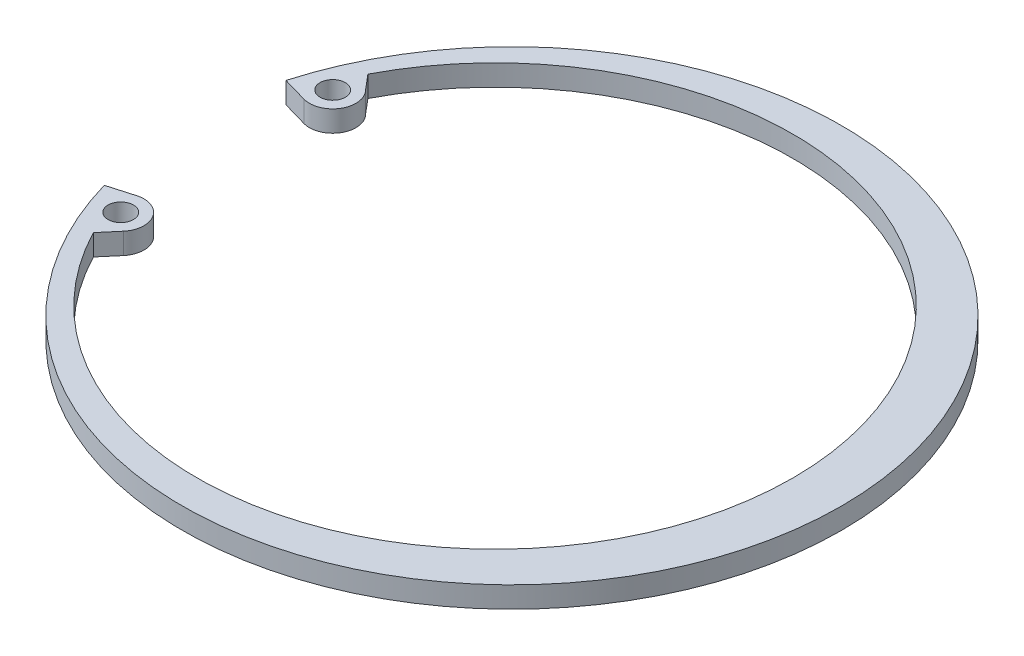
ISO-10303-21;
HEADER;
FILE_DESCRIPTION(('STEP AP214'),'2;1');
FILE_NAME('part.step','',(''),(''),'','','');
FILE_SCHEMA(('AUTOMOTIVE_DESIGN { 1 0 10303 214 1 1 1 1 }'));
ENDSEC;
DATA;
#1=APPLICATION_CONTEXT('core data for automotive mechanical design processes');
#2=APPLICATION_PROTOCOL_DEFINITION('international standard','automotive_design',2000,#1);
#3=PRODUCT_CONTEXT('',#1,'mechanical');
#4=PRODUCT('Part','Part','',(#3));
#5=PRODUCT_RELATED_PRODUCT_CATEGORY('part','',(#4));
#6=PRODUCT_DEFINITION_FORMATION('','',#4);
#7=PRODUCT_DEFINITION_CONTEXT('part definition',#1,'design');
#8=PRODUCT_DEFINITION('design','',#6,#7);
#9=PRODUCT_DEFINITION_SHAPE('','',#8);
#10=(LENGTH_UNIT() NAMED_UNIT(*) SI_UNIT(.MILLI.,.METRE.));
#11=(NAMED_UNIT(*) PLANE_ANGLE_UNIT() SI_UNIT($,.RADIAN.));
#12=(NAMED_UNIT(*) SI_UNIT($,.STERADIAN.) SOLID_ANGLE_UNIT());
#13=UNCERTAINTY_MEASURE_WITH_UNIT(LENGTH_MEASURE(1.E-05),#10,'distance_accuracy_value','');
#14=(GEOMETRIC_REPRESENTATION_CONTEXT(3) GLOBAL_UNCERTAINTY_ASSIGNED_CONTEXT((#13)) GLOBAL_UNIT_ASSIGNED_CONTEXT((#10,
#11,#12)) REPRESENTATION_CONTEXT('',''));
#15=CARTESIAN_POINT('',(0.,0.,0.));
#16=DIRECTION('',(0.,0.,1.));
#17=DIRECTION('',(1.,0.,0.));
#18=AXIS2_PLACEMENT_3D('',#15,#16,#17);
#19=CARTESIAN_POINT('',(0.,-2.5,0.));
#20=DIRECTION('',(0.,1.,0.));
#21=DIRECTION('',(0.,0.,1.));
#22=AXIS2_PLACEMENT_3D('',#19,#20,#21);
#23=CYLINDRICAL_SURFACE('',#22,39.);
#24=CARTESIAN_POINT('',(0.,0.,0.));
#25=DIRECTION('',(0.,1.,0.));
#26=DIRECTION('',(0.,0.,-1.));
#27=AXIS2_PLACEMENT_3D('',#24,#25,#26);
#28=CIRCLE('',#27,39.);
#29=CARTESIAN_POINT('',(-37.4892061415945,0.,10.7498568768627));
#30=VERTEX_POINT('',#29);
#31=CARTESIAN_POINT('',(-37.4892061415945,0.,-10.7498568768627));
#32=VERTEX_POINT('',#31);
#33=EDGE_CURVE('E141',#30,#32,#28,.T.);
#34=ORIENTED_EDGE('',*,*,#33,.F.);
#35=DIRECTION('',(0.,1.,0.));
#36=VECTOR('',#35,1.);
#37=CARTESIAN_POINT('',(-37.4892061415945,-2.5,10.7498568768627));
#38=LINE('',#37,#36);
#39=CARTESIAN_POINT('',(-37.4892061415945,-2.5,10.7498568768627));
#40=VERTEX_POINT('',#39);
#41=EDGE_CURVE('E11',#40,#30,#38,.T.);
#42=ORIENTED_EDGE('',*,*,#41,.F.);
#43=CARTESIAN_POINT('',(0.,-2.5,0.));
#44=DIRECTION('',(0.,1.,0.));
#45=DIRECTION('',(0.,0.,-1.));
#46=AXIS2_PLACEMENT_3D('',#43,#44,#45);
#47=CIRCLE('',#46,39.);
#48=CARTESIAN_POINT('',(-37.4892061415945,-2.5,-10.7498568768627));
#49=VERTEX_POINT('',#48);
#50=EDGE_CURVE('E162',#40,#49,#47,.T.);
#51=ORIENTED_EDGE('',*,*,#50,.T.);
#52=DIRECTION('',(0.,1.,0.));
#53=VECTOR('',#52,1.);
#54=CARTESIAN_POINT('',(-37.4892061415945,-2.5,-10.7498568768627));
#55=LINE('',#54,#53);
#56=EDGE_CURVE('E47',#49,#32,#55,.T.);
#57=ORIENTED_EDGE('',*,*,#56,.T.);
#58=EDGE_LOOP('',(#34,#42,#51,#57));
#59=FACE_BOUND('',#58,.T.);
#60=ADVANCED_FACE('F44',(#59),#23,.T.);
#61=CARTESIAN_POINT('',(-37.4892061415945,-2.5,10.7498568768627));
#62=DIRECTION('',(-0.275637355816993,0.,-0.961261695938321));
#63=DIRECTION('',(-0.961261695938321,0.,0.275637355816993));
#64=AXIS2_PLACEMENT_3D('',#61,#62,#63);
#65=PLANE('',#64);
#66=DIRECTION('',(-0.961261695938321,0.,0.275637355816993));
#67=VECTOR('',#66,1.);
#68=CARTESIAN_POINT('',(-37.4892061415945,0.,10.7498568768627));
#69=LINE('',#68,#67);
#70=CARTESIAN_POINT('',(-34.5080027284967,0.,9.89501055414854));
#71=VERTEX_POINT('',#70);
#72=EDGE_CURVE('E160',#71,#30,#69,.T.);
#73=ORIENTED_EDGE('',*,*,#72,.F.);
#74=DIRECTION('',(0.,1.,0.));
#75=VECTOR('',#74,1.);
#76=CARTESIAN_POINT('',(-34.5080027284967,-2.5,9.89501055414854));
#77=LINE('',#76,#75);
#78=CARTESIAN_POINT('',(-34.5080027284967,-2.5,9.89501055414854));
#79=VERTEX_POINT('',#78);
#80=EDGE_CURVE('E53',#79,#71,#77,.T.);
#81=ORIENTED_EDGE('',*,*,#80,.F.);
#82=DIRECTION('',(-0.961261695938321,0.,0.275637355816993));
#83=VECTOR('',#82,1.);
#84=CARTESIAN_POINT('',(-37.4892061415945,-2.5,10.7498568768627));
#85=LINE('',#84,#83);
#86=EDGE_CURVE('E131',#79,#40,#85,.T.);
#87=ORIENTED_EDGE('',*,*,#86,.T.);
#88=ORIENTED_EDGE('',*,*,#41,.T.);
#89=EDGE_LOOP('',(#73,#81,#87,#88));
#90=FACE_BOUND('',#89,.T.);
#91=ADVANCED_FACE('F174',(#90),#65,.T.);
#92=CARTESIAN_POINT('',(-33.75,-2.5,12.5384802179789));
#93=DIRECTION('',(0.,1.,0.));
#94=DIRECTION('',(0.,0.,1.));
#95=AXIS2_PLACEMENT_3D('',#92,#93,#94);
#96=CYLINDRICAL_SURFACE('',#95,2.75);
#97=CARTESIAN_POINT('',(-33.75,0.,12.5384802179789));
#98=DIRECTION('',(0.,1.,0.));
#99=DIRECTION('',(0.,0.,-1.));
#100=AXIS2_PLACEMENT_3D('',#97,#98,#99);
#101=CIRCLE('',#100,2.75);
#102=CARTESIAN_POINT('',(-31.6534448755003,0.,14.3180747251446));
#103=VERTEX_POINT('',#102);
#104=EDGE_CURVE('E118',#103,#71,#101,.T.);
#105=ORIENTED_EDGE('',*,*,#104,.F.);
#106=DIRECTION('',(0.,1.,0.));
#107=VECTOR('',#106,1.);
#108=CARTESIAN_POINT('',(-31.6534448755003,-2.5,14.3180747251446));
#109=LINE('',#108,#107);
#110=CARTESIAN_POINT('',(-31.6534448755003,-2.5,14.3180747251446));
#111=VERTEX_POINT('',#110);
#112=EDGE_CURVE('E113',#111,#103,#109,.T.);
#113=ORIENTED_EDGE('',*,*,#112,.F.);
#114=CARTESIAN_POINT('',(-33.75,-2.5,12.5384802179789));
#115=DIRECTION('',(0.,1.,0.));
#116=DIRECTION('',(0.,0.,-1.));
#117=AXIS2_PLACEMENT_3D('',#114,#115,#116);
#118=CIRCLE('',#117,2.75);
#119=EDGE_CURVE('E116',#111,#79,#118,.T.);
#120=ORIENTED_EDGE('',*,*,#119,.T.);
#121=ORIENTED_EDGE('',*,*,#80,.T.);
#122=EDGE_LOOP('',(#105,#113,#120,#121));
#123=FACE_BOUND('',#122,.T.);
#124=ADVANCED_FACE('F115',(#123),#96,.T.);
#125=CARTESIAN_POINT('',(-33.2856586696295,-2.5,16.2409994029751));
#126=DIRECTION('',(0.762383681636247,0.,0.647125275332962));
#127=DIRECTION('',(0.647125275332962,0.,-0.762383681636247));
#128=AXIS2_PLACEMENT_3D('',#125,#126,#127);
#129=PLANE('',#128);
#130=DIRECTION('',(0.647125275332962,0.,-0.762383681636247));
#131=VECTOR('',#130,1.);
#132=CARTESIAN_POINT('',(-33.2856586696295,0.,16.2409994029751));
#133=LINE('',#132,#131);
#134=CARTESIAN_POINT('',(-33.2856586696295,0.,16.2409994029751));
#135=VERTEX_POINT('',#134);
#136=EDGE_CURVE('E157',#135,#103,#133,.T.);
#137=ORIENTED_EDGE('',*,*,#136,.F.);
#138=DIRECTION('',(0.,1.,0.));
#139=VECTOR('',#138,1.);
#140=CARTESIAN_POINT('',(-33.2856586696295,-2.5,16.2409994029751));
#141=LINE('',#140,#139);
#142=CARTESIAN_POINT('',(-33.2856586696295,-2.5,16.2409994029751));
#143=VERTEX_POINT('',#142);
#144=EDGE_CURVE('E123',#143,#135,#141,.T.);
#145=ORIENTED_EDGE('',*,*,#144,.F.);
#146=DIRECTION('',(0.647125275332962,0.,-0.762383681636247));
#147=VECTOR('',#146,1.);
#148=CARTESIAN_POINT('',(-33.2856586696295,-2.5,16.2409994029751));
#149=LINE('',#148,#147);
#150=EDGE_CURVE('E129',#143,#111,#149,.T.);
#151=ORIENTED_EDGE('',*,*,#150,.T.);
#152=ORIENTED_EDGE('',*,*,#112,.T.);
#153=EDGE_LOOP('',(#137,#145,#151,#152));
#154=FACE_BOUND('',#153,.T.);
#155=ADVANCED_FACE('F133',(#154),#129,.T.);
#156=CARTESIAN_POINT('',(-2.,-2.5,0.));
#157=DIRECTION('',(0.,1.,0.));
#158=DIRECTION('',(0.,0.,1.));
#159=AXIS2_PLACEMENT_3D('',#156,#157,#158);
#160=CYLINDRICAL_SURFACE('',#159,35.25);
#161=CARTESIAN_POINT('',(-2.,0.,0.));
#162=DIRECTION('',(0.,-1.,0.));
#163=DIRECTION('',(0.,0.,-1.));
#164=AXIS2_PLACEMENT_3D('',#161,#162,#163);
#165=CIRCLE('',#164,35.25);
#166=CARTESIAN_POINT('',(-33.2856586696295,0.,-16.2409994029751));
#167=VERTEX_POINT('',#166);
#168=EDGE_CURVE('E154',#167,#135,#165,.T.);
#169=ORIENTED_EDGE('',*,*,#168,.F.);
#170=DIRECTION('',(0.,1.,0.));
#171=VECTOR('',#170,1.);
#172=CARTESIAN_POINT('',(-33.2856586696295,-2.5,-16.2409994029751));
#173=LINE('',#172,#171);
#174=CARTESIAN_POINT('',(-33.2856586696295,-2.5,-16.2409994029751));
#175=VERTEX_POINT('',#174);
#176=EDGE_CURVE('E166',#175,#167,#173,.T.);
#177=ORIENTED_EDGE('',*,*,#176,.F.);
#178=CARTESIAN_POINT('',(-2.,-2.5,0.));
#179=DIRECTION('',(0.,-1.,0.));
#180=DIRECTION('',(0.,0.,-1.));
#181=AXIS2_PLACEMENT_3D('',#178,#179,#180);
#182=CIRCLE('',#181,35.25);
#183=EDGE_CURVE('E134',#175,#143,#182,.T.);
#184=ORIENTED_EDGE('',*,*,#183,.T.);
#185=ORIENTED_EDGE('',*,*,#144,.T.);
#186=EDGE_LOOP('',(#169,#177,#184,#185));
#187=FACE_BOUND('',#186,.T.);
#188=ADVANCED_FACE('F187',(#187),#160,.F.);
#189=CARTESIAN_POINT('',(-33.2856586696295,-2.5,-16.2409994029751));
#190=DIRECTION('',(0.764402784107994,0.,-0.64473900428619));
#191=DIRECTION('',(-0.64473900428619,0.,-0.764402784107994));
#192=AXIS2_PLACEMENT_3D('',#189,#190,#191);
#193=PLANE('',#192);
#194=DIRECTION('',(-0.64473900428619,0.,-0.764402784107994));
#195=VECTOR('',#194,1.);
#196=CARTESIAN_POINT('',(-33.2856586696295,0.,-16.2409994029751));
#197=LINE('',#196,#195);
#198=CARTESIAN_POINT('',(-31.7882066120602,0.,-14.4656197311008));
#199=VERTEX_POINT('',#198);
#200=EDGE_CURVE('E151',#199,#167,#197,.T.);
#201=ORIENTED_EDGE('',*,*,#200,.F.);
#202=DIRECTION('',(0.,1.,0.));
#203=VECTOR('',#202,1.);
#204=CARTESIAN_POINT('',(-31.7882066120602,-2.5,-14.4656197311008));
#205=LINE('',#204,#203);
#206=CARTESIAN_POINT('',(-31.7882066120602,-2.5,-14.4656197311008));
#207=VERTEX_POINT('',#206);
#208=EDGE_CURVE('E168',#207,#199,#205,.T.);
#209=ORIENTED_EDGE('',*,*,#208,.F.);
#210=DIRECTION('',(-0.64473900428619,0.,-0.764402784107994));
#211=VECTOR('',#210,1.);
#212=CARTESIAN_POINT('',(-33.2856586696295,-2.5,-16.2409994029751));
#213=LINE('',#212,#211);
#214=EDGE_CURVE('E136',#207,#175,#213,.T.);
#215=ORIENTED_EDGE('',*,*,#214,.T.);
#216=ORIENTED_EDGE('',*,*,#176,.T.);
#217=EDGE_LOOP('',(#201,#209,#215,#216));
#218=FACE_BOUND('',#217,.T.);
#219=ADVANCED_FACE('F190',(#218),#193,.T.);
#220=CARTESIAN_POINT('',(-33.75,-2.5,-12.5384802179789));
#221=DIRECTION('',(0.,1.,0.));
#222=DIRECTION('',(0.,0.,1.));
#223=AXIS2_PLACEMENT_3D('',#220,#221,#222);
#224=CYLINDRICAL_SURFACE('',#223,2.75);
#225=CARTESIAN_POINT('',(-33.75,0.,-12.5384802179789));
#226=DIRECTION('',(0.,1.,0.));
#227=DIRECTION('',(0.,0.,1.));
#228=AXIS2_PLACEMENT_3D('',#225,#226,#227);
#229=CIRCLE('',#228,2.75);
#230=CARTESIAN_POINT('',(-34.5080027284967,0.,-9.89501055414853));
#231=VERTEX_POINT('',#230);
#232=EDGE_CURVE('E148',#231,#199,#229,.T.);
#233=ORIENTED_EDGE('',*,*,#232,.F.);
#234=DIRECTION('',(0.,1.,0.));
#235=VECTOR('',#234,1.);
#236=CARTESIAN_POINT('',(-34.5080027284967,-2.5,-9.89501055414853));
#237=LINE('',#236,#235);
#238=CARTESIAN_POINT('',(-34.5080027284967,-2.5,-9.89501055414853));
#239=VERTEX_POINT('',#238);
#240=EDGE_CURVE('E169',#239,#231,#237,.T.);
#241=ORIENTED_EDGE('',*,*,#240,.F.);
#242=CARTESIAN_POINT('',(-33.75,-2.5,-12.5384802179789));
#243=DIRECTION('',(0.,1.,0.));
#244=DIRECTION('',(0.,0.,1.));
#245=AXIS2_PLACEMENT_3D('',#242,#243,#244);
#246=CIRCLE('',#245,2.75);
#247=EDGE_CURVE('E236',#239,#207,#246,.T.);
#248=ORIENTED_EDGE('',*,*,#247,.T.);
#249=ORIENTED_EDGE('',*,*,#208,.T.);
#250=EDGE_LOOP('',(#233,#241,#248,#249));
#251=FACE_BOUND('',#250,.T.);
#252=ADVANCED_FACE('F194',(#251),#224,.T.);
#253=CARTESIAN_POINT('',(-37.4892061415945,-2.5,-10.7498568768627));
#254=DIRECTION('',(-0.275637355816993,0.,0.961261695938321));
#255=DIRECTION('',(0.961261695938321,0.,0.275637355816993));
#256=AXIS2_PLACEMENT_3D('',#253,#254,#255);
#257=PLANE('',#256);
#258=DIRECTION('',(0.961261695938321,0.,0.275637355816993));
#259=VECTOR('',#258,1.);
#260=CARTESIAN_POINT('',(-37.4892061415945,0.,-10.7498568768627));
#261=LINE('',#260,#259);
#262=EDGE_CURVE('E144',#32,#231,#261,.T.);
#263=ORIENTED_EDGE('',*,*,#262,.F.);
#264=ORIENTED_EDGE('',*,*,#56,.F.);
#265=DIRECTION('',(0.961261695938321,0.,0.275637355816993));
#266=VECTOR('',#265,1.);
#267=CARTESIAN_POINT('',(-37.4892061415945,-2.5,-10.7498568768627));
#268=LINE('',#267,#266);
#269=EDGE_CURVE('E234',#49,#239,#268,.T.);
#270=ORIENTED_EDGE('',*,*,#269,.T.);
#271=ORIENTED_EDGE('',*,*,#240,.T.);
#272=EDGE_LOOP('',(#263,#264,#270,#271));
#273=FACE_BOUND('',#272,.T.);
#274=ADVANCED_FACE('F171',(#273),#257,.T.);
#275=CARTESIAN_POINT('',(0.,-2.5,0.));
#276=DIRECTION('',(0.,-1.,0.));
#277=DIRECTION('',(0.,0.,-1.));
#278=AXIS2_PLACEMENT_3D('',#275,#276,#277);
#279=PLANE('',#278);
#280=CARTESIAN_POINT('',(-33.75,-2.5,12.5384802179789));
#281=DIRECTION('',(0.,1.,0.));
#282=DIRECTION('',(0.,0.,-1.));
#283=AXIS2_PLACEMENT_3D('',#280,#281,#282);
#284=CIRCLE('',#283,1.5);
#285=CARTESIAN_POINT('',(-33.75,-2.5,11.0384802179789));
#286=VERTEX_POINT('',#285);
#287=EDGE_CURVE('E221',#286,#286,#284,.T.);
#288=ORIENTED_EDGE('',*,*,#287,.T.);
#289=EDGE_LOOP('',(#288));
#290=FACE_BOUND('',#289,.T.);
#291=CARTESIAN_POINT('',(-33.75,-2.5,-12.5384802179789));
#292=DIRECTION('',(0.,1.,0.));
#293=DIRECTION('',(0.,0.,1.));
#294=AXIS2_PLACEMENT_3D('',#291,#292,#293);
#295=CIRCLE('',#294,1.5);
#296=CARTESIAN_POINT('',(-33.75,-2.5,-11.0384802179789));
#297=VERTEX_POINT('',#296);
#298=EDGE_CURVE('E145',#297,#297,#295,.T.);
#299=ORIENTED_EDGE('',*,*,#298,.T.);
#300=EDGE_LOOP('',(#299));
#301=FACE_BOUND('',#300,.T.);
#302=ORIENTED_EDGE('',*,*,#50,.F.);
#303=ORIENTED_EDGE('',*,*,#86,.F.);
#304=ORIENTED_EDGE('',*,*,#119,.F.);
#305=ORIENTED_EDGE('',*,*,#150,.F.);
#306=ORIENTED_EDGE('',*,*,#183,.F.);
#307=ORIENTED_EDGE('',*,*,#214,.F.);
#308=ORIENTED_EDGE('',*,*,#247,.F.);
#309=ORIENTED_EDGE('',*,*,#269,.F.);
#310=EDGE_LOOP('',(#302,#303,#304,#305,#306,#307,#308,#309));
#311=FACE_BOUND('',#310,.T.);
#312=ADVANCED_FACE('F127',(#290,#301,#311),#279,.T.);
#313=CARTESIAN_POINT('',(0.,0.,0.));
#314=DIRECTION('',(0.,-1.,0.));
#315=DIRECTION('',(0.,0.,-1.));
#316=AXIS2_PLACEMENT_3D('',#313,#314,#315);
#317=PLANE('',#316);
#318=CARTESIAN_POINT('',(-33.75,0.,12.5384802179789));
#319=DIRECTION('',(0.,1.,0.));
#320=DIRECTION('',(0.,0.,-1.));
#321=AXIS2_PLACEMENT_3D('',#318,#319,#320);
#322=CIRCLE('',#321,1.5);
#323=CARTESIAN_POINT('',(-33.75,0.,11.0384802179789));
#324=VERTEX_POINT('',#323);
#325=EDGE_CURVE('E224',#324,#324,#322,.T.);
#326=ORIENTED_EDGE('',*,*,#325,.F.);
#327=EDGE_LOOP('',(#326));
#328=FACE_BOUND('',#327,.T.);
#329=CARTESIAN_POINT('',(-33.75,0.,-12.5384802179789));
#330=DIRECTION('',(0.,1.,0.));
#331=DIRECTION('',(0.,0.,1.));
#332=AXIS2_PLACEMENT_3D('',#329,#330,#331);
#333=CIRCLE('',#332,1.5);
#334=CARTESIAN_POINT('',(-33.75,0.,-11.0384802179789));
#335=VERTEX_POINT('',#334);
#336=EDGE_CURVE('E226',#335,#335,#333,.T.);
#337=ORIENTED_EDGE('',*,*,#336,.F.);
#338=EDGE_LOOP('',(#337));
#339=FACE_BOUND('',#338,.T.);
#340=ORIENTED_EDGE('',*,*,#33,.T.);
#341=ORIENTED_EDGE('',*,*,#262,.T.);
#342=ORIENTED_EDGE('',*,*,#232,.T.);
#343=ORIENTED_EDGE('',*,*,#200,.T.);
#344=ORIENTED_EDGE('',*,*,#168,.T.);
#345=ORIENTED_EDGE('',*,*,#136,.T.);
#346=ORIENTED_EDGE('',*,*,#104,.T.);
#347=ORIENTED_EDGE('',*,*,#72,.T.);
#348=EDGE_LOOP('',(#340,#341,#342,#343,#344,#345,#346,#347));
#349=FACE_BOUND('',#348,.T.);
#350=ADVANCED_FACE('F173',(#328,#339,#349),#317,.F.);
#351=CARTESIAN_POINT('',(-33.75,-2.5,-12.5384802179789));
#352=DIRECTION('',(0.,1.,0.));
#353=DIRECTION('',(0.,0.,1.));
#354=AXIS2_PLACEMENT_3D('',#351,#352,#353);
#355=CYLINDRICAL_SURFACE('',#354,1.5);
#356=ORIENTED_EDGE('',*,*,#298,.F.);
#357=EDGE_LOOP('',(#356));
#358=FACE_BOUND('',#357,.T.);
#359=ORIENTED_EDGE('',*,*,#336,.T.);
#360=EDGE_LOOP('',(#359));
#361=FACE_BOUND('',#360,.T.);
#362=ADVANCED_FACE('F206',(#358,#361),#355,.F.);
#363=CARTESIAN_POINT('',(-33.75,-2.5,12.5384802179789));
#364=DIRECTION('',(0.,1.,0.));
#365=DIRECTION('',(0.,0.,1.));
#366=AXIS2_PLACEMENT_3D('',#363,#364,#365);
#367=CYLINDRICAL_SURFACE('',#366,1.5);
#368=ORIENTED_EDGE('',*,*,#287,.F.);
#369=EDGE_LOOP('',(#368));
#370=FACE_BOUND('',#369,.T.);
#371=ORIENTED_EDGE('',*,*,#325,.T.);
#372=EDGE_LOOP('',(#371));
#373=FACE_BOUND('',#372,.T.);
#374=ADVANCED_FACE('F213',(#370,#373),#367,.F.);
#375=CLOSED_SHELL('',(#60,#91,#124,#155,#188,#219,#252,#274,#312,#350,#362,#374));
#376=MANIFOLD_SOLID_BREP('B2',#375);
#377=ADVANCED_BREP_SHAPE_REPRESENTATION('',(#18,#376),#14);
#378=SHAPE_DEFINITION_REPRESENTATION(#9,#377);
ENDSEC;
END-ISO-10303-21;
